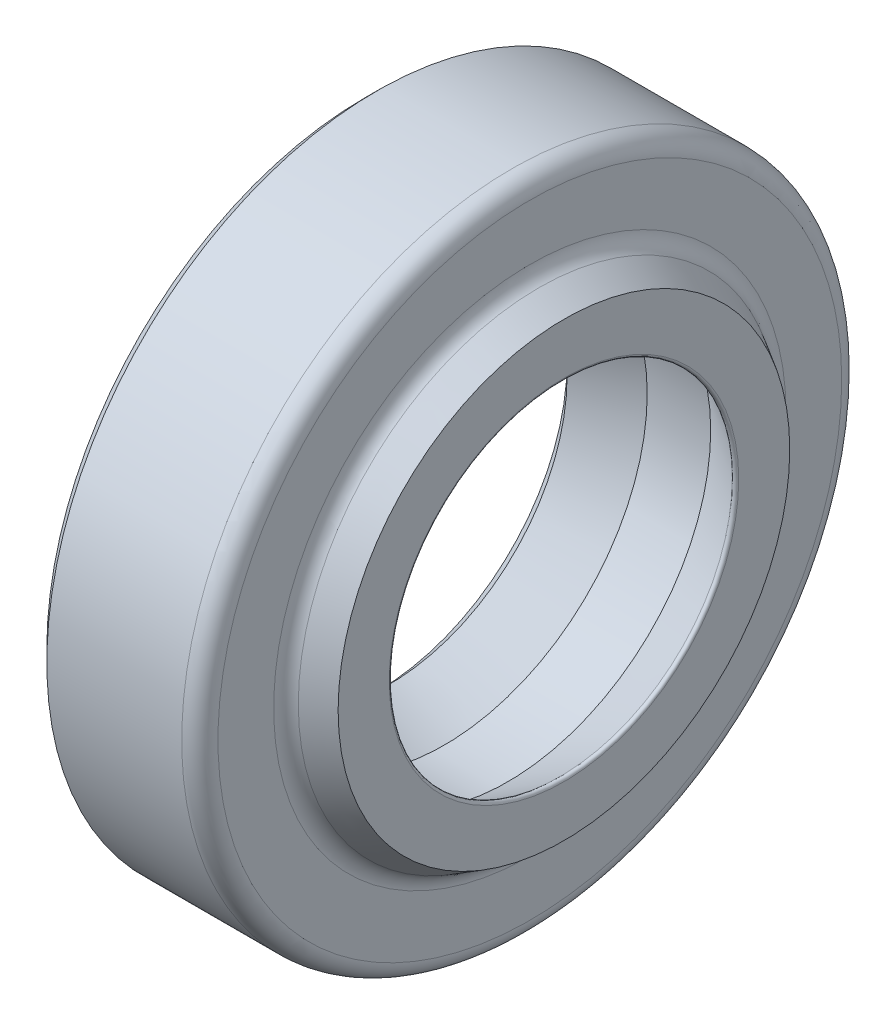
ISO-10303-21;
HEADER;
FILE_DESCRIPTION(('STEP AP214'),'2;1');
FILE_NAME('part.step','',(''),(''),'','','');
FILE_SCHEMA(('AUTOMOTIVE_DESIGN { 1 0 10303 214 1 1 1 1 }'));
ENDSEC;
DATA;
#1=APPLICATION_CONTEXT('core data for automotive mechanical design processes');
#2=APPLICATION_PROTOCOL_DEFINITION('international standard','automotive_design',2000,#1);
#3=PRODUCT_CONTEXT('',#1,'mechanical');
#4=PRODUCT('Part','Part','',(#3));
#5=PRODUCT_RELATED_PRODUCT_CATEGORY('part','',(#4));
#6=PRODUCT_DEFINITION_FORMATION('','',#4);
#7=PRODUCT_DEFINITION_CONTEXT('part definition',#1,'design');
#8=PRODUCT_DEFINITION('design','',#6,#7);
#9=PRODUCT_DEFINITION_SHAPE('','',#8);
#10=(LENGTH_UNIT() NAMED_UNIT(*) SI_UNIT(.MILLI.,.METRE.));
#11=(NAMED_UNIT(*) PLANE_ANGLE_UNIT() SI_UNIT($,.RADIAN.));
#12=(NAMED_UNIT(*) SI_UNIT($,.STERADIAN.) SOLID_ANGLE_UNIT());
#13=UNCERTAINTY_MEASURE_WITH_UNIT(LENGTH_MEASURE(1.E-05),#10,'distance_accuracy_value','');
#14=(GEOMETRIC_REPRESENTATION_CONTEXT(3) GLOBAL_UNCERTAINTY_ASSIGNED_CONTEXT((#13)) GLOBAL_UNIT_ASSIGNED_CONTEXT((#10,
#11,#12)) REPRESENTATION_CONTEXT('',''));
#15=CARTESIAN_POINT('',(0.,0.,0.));
#16=DIRECTION('',(0.,0.,1.));
#17=DIRECTION('',(1.,0.,0.));
#18=AXIS2_PLACEMENT_3D('',#15,#16,#17);
#19=CARTESIAN_POINT('',(-2.7428317,0.,0.));
#20=DIRECTION('',(-1.,0.,0.));
#21=DIRECTION('',(0.,0.,1.));
#22=AXIS2_PLACEMENT_3D('',#19,#20,#21);
#23=CONICAL_SURFACE('',#22,5.95249,0.785398163397455);
#24=CARTESIAN_POINT('',(-2.3453217,0.,0.));
#25=DIRECTION('',(1.,0.,0.));
#26=DIRECTION('',(0.,0.,-1.));
#27=AXIS2_PLACEMENT_3D('',#24,#25,#26);
#28=CIRCLE('',#27,5.55498);
#29=CARTESIAN_POINT('',(-2.3453217,0.,-5.55498000000001));
#30=VERTEX_POINT('',#29);
#31=EDGE_CURVE('E12',#30,#30,#28,.T.);
#32=ORIENTED_EDGE('',*,*,#31,.T.);
#33=EDGE_LOOP('',(#32));
#34=FACE_BOUND('',#33,.T.);
#35=CARTESIAN_POINT('',(-2.7428317,0.,0.));
#36=DIRECTION('',(1.,0.,0.));
#37=DIRECTION('',(0.,0.,-1.));
#38=AXIS2_PLACEMENT_3D('',#35,#36,#37);
#39=CIRCLE('',#38,5.95249);
#40=CARTESIAN_POINT('',(-2.7428317,0.,-5.95249000000001));
#41=VERTEX_POINT('',#40);
#42=EDGE_CURVE('E98',#41,#41,#39,.T.);
#43=ORIENTED_EDGE('',*,*,#42,.F.);
#44=EDGE_LOOP('',(#43));
#45=FACE_BOUND('',#44,.T.);
#46=ADVANCED_FACE('F43',(#34,#45),#23,.F.);
#47=CARTESIAN_POINT('',(-2.3453217,0.,0.));
#48=DIRECTION('',(1.,0.,0.));
#49=DIRECTION('',(0.,0.,-1.));
#50=AXIS2_PLACEMENT_3D('',#47,#48,#49);
#51=CONICAL_SURFACE('',#50,5.55498,0.434600167822203);
#52=CARTESIAN_POINT('',(-0.632656849999996,0.,0.));
#53=DIRECTION('',(1.,0.,0.));
#54=DIRECTION('',(0.,0.,-1.));
#55=AXIS2_PLACEMENT_3D('',#52,#53,#54);
#56=CIRCLE('',#55,6.35);
#57=CARTESIAN_POINT('',(-0.632656849999996,0.,-6.35000000000001));
#58=VERTEX_POINT('',#57);
#59=EDGE_CURVE('E49',#58,#58,#56,.T.);
#60=ORIENTED_EDGE('',*,*,#59,.T.);
#61=EDGE_LOOP('',(#60));
#62=FACE_BOUND('',#61,.T.);
#63=ORIENTED_EDGE('',*,*,#31,.F.);
#64=EDGE_LOOP('',(#63));
#65=FACE_BOUND('',#64,.T.);
#66=ADVANCED_FACE('F106',(#62,#65),#51,.F.);
#67=CARTESIAN_POINT('',(-3.1115,0.,0.));
#68=DIRECTION('',(1.,0.,0.));
#69=DIRECTION('',(0.,0.,-1.));
#70=AXIS2_PLACEMENT_3D('',#67,#68,#69);
#71=CYLINDRICAL_SURFACE('',#70,6.35);
#72=CARTESIAN_POINT('',(1.35371693438145,0.,0.));
#73=DIRECTION('',(1.,0.,0.));
#74=DIRECTION('',(0.,0.,-1.));
#75=AXIS2_PLACEMENT_3D('',#72,#73,#74);
#76=CIRCLE('',#75,6.35);
#77=CARTESIAN_POINT('',(1.35371693438145,0.,-6.35000000000001));
#78=VERTEX_POINT('',#77);
#79=EDGE_CURVE('E53',#78,#78,#76,.T.);
#80=ORIENTED_EDGE('',*,*,#79,.T.);
#81=EDGE_LOOP('',(#80));
#82=FACE_BOUND('',#81,.T.);
#83=ORIENTED_EDGE('',*,*,#59,.F.);
#84=EDGE_LOOP('',(#83));
#85=FACE_BOUND('',#84,.T.);
#86=ADVANCED_FACE('F110',(#82,#85),#71,.F.);
#87=CARTESIAN_POINT('',(1.35371693438145,0.,0.));
#88=DIRECTION('',(-1.,0.,0.));
#89=DIRECTION('',(0.,0.,1.));
#90=AXIS2_PLACEMENT_3D('',#87,#88,#89);
#91=CONICAL_SURFACE('',#90,6.35,0.529376611836845);
#92=CARTESIAN_POINT('',(2.98345905661698,0.,0.));
#93=DIRECTION('',(1.,0.,0.));
#94=DIRECTION('',(0.,0.,-1.));
#95=AXIS2_PLACEMENT_3D('',#92,#93,#94);
#96=CIRCLE('',#95,5.39647060672637);
#97=CARTESIAN_POINT('',(2.98345905661698,0.,-5.39647060672639));
#98=VERTEX_POINT('',#97);
#99=EDGE_CURVE('E57',#98,#98,#96,.T.);
#100=ORIENTED_EDGE('',*,*,#99,.T.);
#101=EDGE_LOOP('',(#100));
#102=FACE_BOUND('',#101,.T.);
#103=ORIENTED_EDGE('',*,*,#79,.F.);
#104=EDGE_LOOP('',(#103));
#105=FACE_BOUND('',#104,.T.);
#106=ADVANCED_FACE('F114',(#102,#105),#91,.F.);
#107=CARTESIAN_POINT('',(3.0264227,0.,0.));
#108=DIRECTION('',(1.,0.,0.));
#109=DIRECTION('',(0.,0.,-1.));
#110=AXIS2_PLACEMENT_3D('',#107,#108,#109);
#111=TOROIDAL_SURFACE('',#110,5.4699027,0.0850772999999993);
#112=CARTESIAN_POINT('',(3.1115,0.,0.));
#113=DIRECTION('',(1.,0.,0.));
#114=DIRECTION('',(0.,0.,-1.));
#115=AXIS2_PLACEMENT_3D('',#112,#113,#114);
#116=CIRCLE('',#115,5.4699027);
#117=CARTESIAN_POINT('',(3.1115,0.,-5.46990270000008));
#118=VERTEX_POINT('',#117);
#119=EDGE_CURVE('E62',#118,#118,#116,.T.);
#120=ORIENTED_EDGE('',*,*,#119,.T.);
#121=EDGE_LOOP('',(#120));
#122=FACE_BOUND('',#121,.T.);
#123=ORIENTED_EDGE('',*,*,#99,.F.);
#124=EDGE_LOOP('',(#123));
#125=FACE_BOUND('',#124,.T.);
#126=ADVANCED_FACE('F121',(#122,#125),#111,.T.);
#127=CARTESIAN_POINT('',(3.11149999999999,5.46990270000004,-1.11022302462516E-13));
#128=DIRECTION('',(1.,0.,0.));
#129=DIRECTION('',(0.,0.,-1.));
#130=AXIS2_PLACEMENT_3D('',#127,#128,#129);
#131=PLANE('',#130);
#132=CARTESIAN_POINT('',(3.1115,0.,0.));
#133=DIRECTION('',(1.,0.,0.));
#134=DIRECTION('',(0.,0.,-1.));
#135=AXIS2_PLACEMENT_3D('',#132,#133,#134);
#136=CIRCLE('',#135,7.065518);
#137=CARTESIAN_POINT('',(3.1115,0.,-7.06551800000008));
#138=VERTEX_POINT('',#137);
#139=EDGE_CURVE('E65',#138,#138,#136,.T.);
#140=ORIENTED_EDGE('',*,*,#139,.T.);
#141=EDGE_LOOP('',(#140));
#142=FACE_BOUND('',#141,.T.);
#143=ORIENTED_EDGE('',*,*,#119,.F.);
#144=EDGE_LOOP('',(#143));
#145=FACE_BOUND('',#144,.T.);
#146=ADVANCED_FACE('F125',(#142,#145),#131,.T.);
#147=CARTESIAN_POINT('',(3.1115,0.,0.));
#148=DIRECTION('',(-1.,0.,0.));
#149=DIRECTION('',(0.,0.,1.));
#150=AXIS2_PLACEMENT_3D('',#147,#148,#149);
#151=CONICAL_SURFACE('',#150,7.065518,0.529376611836843);
#152=CARTESIAN_POINT('',(2.32545771077987,0.,0.));
#153=DIRECTION('',(1.,0.,0.));
#154=DIRECTION('',(0.,0.,-1.));
#155=AXIS2_PLACEMENT_3D('',#152,#153,#154);
#156=CIRCLE('',#155,7.52541556103215);
#157=CARTESIAN_POINT('',(2.32545771077987,0.,-7.52541556103216));
#158=VERTEX_POINT('',#157);
#159=EDGE_CURVE('E68',#158,#158,#156,.T.);
#160=ORIENTED_EDGE('',*,*,#159,.T.);
#161=EDGE_LOOP('',(#160));
#162=FACE_BOUND('',#161,.T.);
#163=ORIENTED_EDGE('',*,*,#139,.F.);
#164=EDGE_LOOP('',(#163));
#165=FACE_BOUND('',#164,.T.);
#166=ADVANCED_FACE('F129',(#162,#165),#151,.T.);
#167=CARTESIAN_POINT('',(2.611882,0.,0.));
#168=DIRECTION('',(1.,0.,0.));
#169=DIRECTION('',(0.,0.,-1.));
#170=AXIS2_PLACEMENT_3D('',#167,#168,#169);
#171=TOROIDAL_SURFACE('',#170,8.014962849523,0.567182000000001);
#172=CARTESIAN_POINT('',(2.0447,0.,0.));
#173=DIRECTION('',(1.,0.,0.));
#174=DIRECTION('',(0.,0.,-1.));
#175=AXIS2_PLACEMENT_3D('',#172,#173,#174);
#176=CIRCLE('',#175,8.014962849523);
#177=CARTESIAN_POINT('',(2.0447,0.,-8.01496284952301));
#178=VERTEX_POINT('',#177);
#179=EDGE_CURVE('E71',#178,#178,#176,.T.);
#180=ORIENTED_EDGE('',*,*,#179,.T.);
#181=EDGE_LOOP('',(#180));
#182=FACE_BOUND('',#181,.T.);
#183=ORIENTED_EDGE('',*,*,#159,.F.);
#184=EDGE_LOOP('',(#183));
#185=FACE_BOUND('',#184,.T.);
#186=ADVANCED_FACE('F133',(#182,#185),#171,.F.);
#187=CARTESIAN_POINT('',(2.0447,8.01496284952301,0.));
#188=DIRECTION('',(1.,0.,0.));
#189=DIRECTION('',(0.,0.,-1.));
#190=AXIS2_PLACEMENT_3D('',#187,#188,#189);
#191=PLANE('',#190);
#192=CARTESIAN_POINT('',(2.0447,0.,0.));
#193=DIRECTION('',(1.,0.,0.));
#194=DIRECTION('',(0.,0.,-1.));
#195=AXIS2_PLACEMENT_3D('',#192,#193,#194);
#196=CIRCLE('',#195,9.757918);
#197=CARTESIAN_POINT('',(2.0447,0.,-9.75791800000001));
#198=VERTEX_POINT('',#197);
#199=EDGE_CURVE('E74',#198,#198,#196,.T.);
#200=ORIENTED_EDGE('',*,*,#199,.T.);
#201=EDGE_LOOP('',(#200));
#202=FACE_BOUND('',#201,.T.);
#203=ORIENTED_EDGE('',*,*,#179,.F.);
#204=EDGE_LOOP('',(#203));
#205=FACE_BOUND('',#204,.T.);
#206=ADVANCED_FACE('F137',(#202,#205),#191,.T.);
#207=CARTESIAN_POINT('',(1.477518,0.,0.));
#208=DIRECTION('',(1.,0.,0.));
#209=DIRECTION('',(0.,0.,-1.));
#210=AXIS2_PLACEMENT_3D('',#207,#208,#209);
#211=TOROIDAL_SURFACE('',#210,9.757918,0.567182000000001);
#212=CARTESIAN_POINT('',(1.477518,0.,0.));
#213=DIRECTION('',(1.,0.,0.));
#214=DIRECTION('',(0.,0.,-1.));
#215=AXIS2_PLACEMENT_3D('',#212,#213,#214);
#216=CIRCLE('',#215,10.3251);
#217=CARTESIAN_POINT('',(1.477518,0.,-10.3251));
#218=VERTEX_POINT('',#217);
#219=EDGE_CURVE('E77',#218,#218,#216,.T.);
#220=ORIENTED_EDGE('',*,*,#219,.T.);
#221=EDGE_LOOP('',(#220));
#222=FACE_BOUND('',#221,.T.);
#223=ORIENTED_EDGE('',*,*,#199,.F.);
#224=EDGE_LOOP('',(#223));
#225=FACE_BOUND('',#224,.T.);
#226=ADVANCED_FACE('F141',(#222,#225),#211,.T.);
#227=CARTESIAN_POINT('',(-3.1115,0.,0.));
#228=DIRECTION('',(1.,0.,0.));
#229=DIRECTION('',(0.,0.,-1.));
#230=AXIS2_PLACEMENT_3D('',#227,#228,#229);
#231=CYLINDRICAL_SURFACE('',#230,10.3251);
#232=CARTESIAN_POINT('',(-2.7428317,0.,0.));
#233=DIRECTION('',(1.,0.,0.));
#234=DIRECTION('',(0.,0.,-1.));
#235=AXIS2_PLACEMENT_3D('',#232,#233,#234);
#236=CIRCLE('',#235,10.3251);
#237=CARTESIAN_POINT('',(-2.7428317,0.,-10.3251));
#238=VERTEX_POINT('',#237);
#239=EDGE_CURVE('E80',#238,#238,#236,.T.);
#240=ORIENTED_EDGE('',*,*,#239,.T.);
#241=EDGE_LOOP('',(#240));
#242=FACE_BOUND('',#241,.T.);
#243=ORIENTED_EDGE('',*,*,#219,.F.);
#244=EDGE_LOOP('',(#243));
#245=FACE_BOUND('',#244,.T.);
#246=ADVANCED_FACE('F145',(#242,#245),#231,.T.);
#247=CARTESIAN_POINT('',(-2.7428317,0.,0.));
#248=DIRECTION('',(1.,0.,0.));
#249=DIRECTION('',(0.,0.,-1.));
#250=AXIS2_PLACEMENT_3D('',#247,#248,#249);
#251=CONICAL_SURFACE('',#250,10.3251,0.785398163397447);
#252=CARTESIAN_POINT('',(-3.1115,0.,0.));
#253=DIRECTION('',(1.,0.,0.));
#254=DIRECTION('',(0.,0.,-1.));
#255=AXIS2_PLACEMENT_3D('',#252,#253,#254);
#256=CIRCLE('',#255,9.9564317);
#257=CARTESIAN_POINT('',(-3.1115,0.,-9.95643170000001));
#258=VERTEX_POINT('',#257);
#259=EDGE_CURVE('E83',#258,#258,#256,.T.);
#260=ORIENTED_EDGE('',*,*,#259,.T.);
#261=EDGE_LOOP('',(#260));
#262=FACE_BOUND('',#261,.T.);
#263=ORIENTED_EDGE('',*,*,#239,.F.);
#264=EDGE_LOOP('',(#263));
#265=FACE_BOUND('',#264,.T.);
#266=ADVANCED_FACE('F149',(#262,#265),#251,.T.);
#267=CARTESIAN_POINT('',(-3.1115,9.95643170000002,0.));
#268=DIRECTION('',(-1.,0.,0.));
#269=DIRECTION('',(0.,0.,1.));
#270=AXIS2_PLACEMENT_3D('',#267,#268,#269);
#271=PLANE('',#270);
#272=CARTESIAN_POINT('',(-3.1115,0.,0.));
#273=DIRECTION('',(1.,0.,0.));
#274=DIRECTION('',(0.,0.,-1.));
#275=AXIS2_PLACEMENT_3D('',#272,#273,#274);
#276=CIRCLE('',#275,9.013317);
#277=CARTESIAN_POINT('',(-3.1115,0.,-9.01331700000001));
#278=VERTEX_POINT('',#277);
#279=EDGE_CURVE('E86',#278,#278,#276,.T.);
#280=ORIENTED_EDGE('',*,*,#279,.T.);
#281=EDGE_LOOP('',(#280));
#282=FACE_BOUND('',#281,.T.);
#283=ORIENTED_EDGE('',*,*,#259,.F.);
#284=EDGE_LOOP('',(#283));
#285=FACE_BOUND('',#284,.T.);
#286=ADVANCED_FACE('F153',(#282,#285),#271,.T.);
#287=CARTESIAN_POINT('',(-3.1115,0.,0.));
#288=DIRECTION('',(-1.,0.,0.));
#289=DIRECTION('',(0.,0.,1.));
#290=AXIS2_PLACEMENT_3D('',#287,#288,#289);
#291=CONICAL_SURFACE('',#290,9.013317,0.174843568031452);
#292=CARTESIAN_POINT('',(-0.866916034882093,0.,0.));
#293=DIRECTION('',(1.,0.,0.));
#294=DIRECTION('',(0.,0.,-1.));
#295=AXIS2_PLACEMENT_3D('',#292,#293,#294);
#296=CIRCLE('',#295,8.61681730438448);
#297=CARTESIAN_POINT('',(-0.866916034882093,0.,-8.61681730438456));
#298=VERTEX_POINT('',#297);
#299=EDGE_CURVE('E89',#298,#298,#296,.T.);
#300=ORIENTED_EDGE('',*,*,#299,.T.);
#301=EDGE_LOOP('',(#300));
#302=FACE_BOUND('',#301,.T.);
#303=ORIENTED_EDGE('',*,*,#279,.F.);
#304=EDGE_LOOP('',(#303));
#305=FACE_BOUND('',#304,.T.);
#306=ADVANCED_FACE('F157',(#302,#305),#291,.F.);
#307=CARTESIAN_POINT('',(-0.916247849999996,0.,0.));
#308=DIRECTION('',(1.,0.,0.));
#309=DIRECTION('',(0.,0.,-1.));
#310=AXIS2_PLACEMENT_3D('',#307,#308,#309);
#311=TOROIDAL_SURFACE('',#310,8.33755,0.283590999999999);
#312=CARTESIAN_POINT('',(-0.866916034882093,0.,0.));
#313=DIRECTION('',(1.,0.,0.));
#314=DIRECTION('',(0.,0.,-1.));
#315=AXIS2_PLACEMENT_3D('',#312,#313,#314);
#316=CIRCLE('',#315,8.05828269561552);
#317=CARTESIAN_POINT('',(-0.866916034882093,0.,-8.0582826956156));
#318=VERTEX_POINT('',#317);
#319=EDGE_CURVE('E92',#318,#318,#316,.T.);
#320=ORIENTED_EDGE('',*,*,#319,.T.);
#321=EDGE_LOOP('',(#320));
#322=FACE_BOUND('',#321,.T.);
#323=ORIENTED_EDGE('',*,*,#299,.F.);
#324=EDGE_LOOP('',(#323));
#325=FACE_BOUND('',#324,.T.);
#326=ADVANCED_FACE('F161',(#322,#325),#311,.F.);
#327=CARTESIAN_POINT('',(-0.866916034882093,0.,0.));
#328=DIRECTION('',(1.,0.,0.));
#329=DIRECTION('',(0.,0.,-1.));
#330=AXIS2_PLACEMENT_3D('',#327,#328,#329);
#331=CONICAL_SURFACE('',#330,8.05828269561552,0.174843568031452);
#332=CARTESIAN_POINT('',(-2.7428317,0.,0.));
#333=DIRECTION('',(1.,0.,0.));
#334=DIRECTION('',(0.,0.,-1.));
#335=AXIS2_PLACEMENT_3D('',#332,#333,#334);
#336=CIRCLE('',#335,7.72690725955311);
#337=CARTESIAN_POINT('',(-2.7428317,0.,-7.72690725955312));
#338=VERTEX_POINT('',#337);
#339=EDGE_CURVE('E95',#338,#338,#336,.T.);
#340=ORIENTED_EDGE('',*,*,#339,.T.);
#341=EDGE_LOOP('',(#340));
#342=FACE_BOUND('',#341,.T.);
#343=ORIENTED_EDGE('',*,*,#319,.F.);
#344=EDGE_LOOP('',(#343));
#345=FACE_BOUND('',#344,.T.);
#346=ADVANCED_FACE('F165',(#342,#345),#331,.T.);
#347=CARTESIAN_POINT('',(-2.7428317,7.72690725955315,0.));
#348=DIRECTION('',(-1.,0.,0.));
#349=DIRECTION('',(0.,0.,1.));
#350=AXIS2_PLACEMENT_3D('',#347,#348,#349);
#351=PLANE('',#350);
#352=ORIENTED_EDGE('',*,*,#42,.T.);
#353=EDGE_LOOP('',(#352));
#354=FACE_BOUND('',#353,.T.);
#355=ORIENTED_EDGE('',*,*,#339,.F.);
#356=EDGE_LOOP('',(#355));
#357=FACE_BOUND('',#356,.T.);
#358=ADVANCED_FACE('F102',(#354,#357),#351,.T.);
#359=CLOSED_SHELL('',(#46,#66,#86,#106,#126,#146,#166,#186,#206,#226,#246,#266,#286,#306,#326,
#346,#358));
#360=MANIFOLD_SOLID_BREP('B2',#359);
#361=ADVANCED_BREP_SHAPE_REPRESENTATION('',(#18,#360),#14);
#362=SHAPE_DEFINITION_REPRESENTATION(#9,#361);
ENDSEC;
END-ISO-10303-21;
